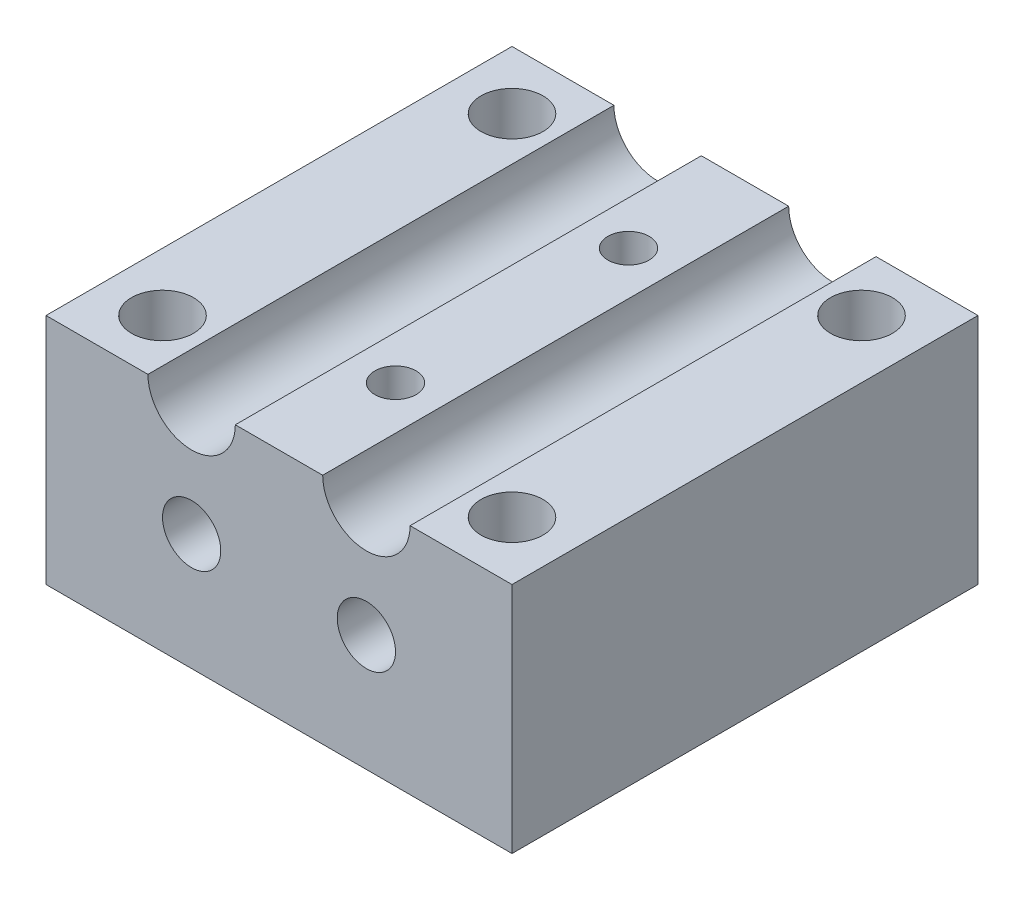
ISO-10303-21;
HEADER;
FILE_DESCRIPTION(('STEP AP214'),'2;1');
FILE_NAME('part.step','',(''),(''),'','','');
FILE_SCHEMA(('AUTOMOTIVE_DESIGN { 1 0 10303 214 1 1 1 1 }'));
ENDSEC;
DATA;
#1=APPLICATION_CONTEXT('core data for automotive mechanical design processes');
#2=APPLICATION_PROTOCOL_DEFINITION('international standard','automotive_design',2000,#1);
#3=PRODUCT_CONTEXT('',#1,'mechanical');
#4=PRODUCT('Part','Part','',(#3));
#5=PRODUCT_RELATED_PRODUCT_CATEGORY('part','',(#4));
#6=PRODUCT_DEFINITION_FORMATION('','',#4);
#7=PRODUCT_DEFINITION_CONTEXT('part definition',#1,'design');
#8=PRODUCT_DEFINITION('design','',#6,#7);
#9=PRODUCT_DEFINITION_SHAPE('','',#8);
#10=(LENGTH_UNIT() NAMED_UNIT(*) SI_UNIT(.MILLI.,.METRE.));
#11=(NAMED_UNIT(*) PLANE_ANGLE_UNIT() SI_UNIT($,.RADIAN.));
#12=(NAMED_UNIT(*) SI_UNIT($,.STERADIAN.) SOLID_ANGLE_UNIT());
#13=UNCERTAINTY_MEASURE_WITH_UNIT(LENGTH_MEASURE(1.E-05),#10,'distance_accuracy_value','');
#14=(GEOMETRIC_REPRESENTATION_CONTEXT(3) GLOBAL_UNCERTAINTY_ASSIGNED_CONTEXT((#13)) GLOBAL_UNIT_ASSIGNED_CONTEXT((#10,
#11,#12)) REPRESENTATION_CONTEXT('',''));
#15=CARTESIAN_POINT('',(0.,0.,0.));
#16=DIRECTION('',(0.,0.,1.));
#17=DIRECTION('',(1.,0.,0.));
#18=AXIS2_PLACEMENT_3D('',#15,#16,#17);
#19=CARTESIAN_POINT('',(0.,25.4,0.));
#20=DIRECTION('',(0.,-1.,0.));
#21=DIRECTION('',(0.,0.,-1.));
#22=AXIS2_PLACEMENT_3D('',#19,#20,#21);
#23=PLANE('',#22);
#24=CARTESIAN_POINT('',(19.05,25.4,19.05));
#25=DIRECTION('',(0.,1.,0.));
#26=DIRECTION('',(0.,0.,1.));
#27=AXIS2_PLACEMENT_3D('',#24,#25,#26);
#28=CIRCLE('',#27,3.3782);
#29=CARTESIAN_POINT('',(19.05,25.4,22.4282));
#30=VERTEX_POINT('',#29);
#31=EDGE_CURVE('E169',#30,#30,#28,.T.);
#32=ORIENTED_EDGE('',*,*,#31,.F.);
#33=EDGE_LOOP('',(#32));
#34=FACE_BOUND('',#33,.T.);
#35=CARTESIAN_POINT('',(19.05,25.4,-19.05));
#36=DIRECTION('',(0.,1.,0.));
#37=DIRECTION('',(0.,0.,1.));
#38=AXIS2_PLACEMENT_3D('',#35,#36,#37);
#39=CIRCLE('',#38,3.3782);
#40=CARTESIAN_POINT('',(19.05,25.4,-15.6718));
#41=VERTEX_POINT('',#40);
#42=EDGE_CURVE('E163',#41,#41,#39,.T.);
#43=ORIENTED_EDGE('',*,*,#42,.F.);
#44=EDGE_LOOP('',(#43));
#45=FACE_BOUND('',#44,.T.);
#46=DIRECTION('',(-1.,0.,0.));
#47=VECTOR('',#46,1.);
#48=CARTESIAN_POINT('',(25.4,25.4,-25.4));
#49=LINE('',#48,#47);
#50=CARTESIAN_POINT('',(25.4,25.4,-25.4));
#51=VERTEX_POINT('',#50);
#52=CARTESIAN_POINT('',(14.2875,25.4,-25.4));
#53=VERTEX_POINT('',#52);
#54=EDGE_CURVE('E115',#51,#53,#49,.T.);
#55=ORIENTED_EDGE('',*,*,#54,.T.);
#56=DIRECTION('',(0.,0.,1.));
#57=VECTOR('',#56,1.);
#58=CARTESIAN_POINT('',(14.2875,25.4,-25.4));
#59=LINE('',#58,#57);
#60=CARTESIAN_POINT('',(14.2875,25.4,25.4));
#61=VERTEX_POINT('',#60);
#62=EDGE_CURVE('E49',#53,#61,#59,.T.);
#63=ORIENTED_EDGE('',*,*,#62,.T.);
#64=DIRECTION('',(1.,0.,0.));
#65=VECTOR('',#64,1.);
#66=CARTESIAN_POINT('',(25.4,25.4,25.4));
#67=LINE('',#66,#65);
#68=CARTESIAN_POINT('',(25.4,25.4,25.4));
#69=VERTEX_POINT('',#68);
#70=EDGE_CURVE('E152',#61,#69,#67,.T.);
#71=ORIENTED_EDGE('',*,*,#70,.T.);
#72=DIRECTION('',(0.,0.,-1.));
#73=VECTOR('',#72,1.);
#74=CARTESIAN_POINT('',(25.4,25.4,-25.4));
#75=LINE('',#74,#73);
#76=EDGE_CURVE('E119',#69,#51,#75,.T.);
#77=ORIENTED_EDGE('',*,*,#76,.T.);
#78=EDGE_LOOP('',(#55,#63,#71,#77));
#79=FACE_BOUND('',#78,.T.);
#80=ADVANCED_FACE('F34',(#34,#45,#79),#23,.F.);
#81=CARTESIAN_POINT('',(0.,25.4,-12.7));
#82=DIRECTION('',(0.,1.,0.));
#83=DIRECTION('',(0.,0.,1.));
#84=AXIS2_PLACEMENT_3D('',#81,#82,#83);
#85=CIRCLE('',#84,2.24789999999999);
#86=CARTESIAN_POINT('',(0.,25.4,-10.4521));
#87=VERTEX_POINT('',#86);
#88=EDGE_CURVE('E205',#87,#87,#85,.T.);
#89=ORIENTED_EDGE('',*,*,#88,.F.);
#90=EDGE_LOOP('',(#89));
#91=FACE_BOUND('',#90,.T.);
#92=CARTESIAN_POINT('',(0.,25.4,12.7));
#93=DIRECTION('',(0.,1.,0.));
#94=DIRECTION('',(0.,0.,1.));
#95=AXIS2_PLACEMENT_3D('',#92,#93,#94);
#96=CIRCLE('',#95,2.24789999999999);
#97=CARTESIAN_POINT('',(0.,25.4,14.9479));
#98=VERTEX_POINT('',#97);
#99=EDGE_CURVE('E199',#98,#98,#96,.T.);
#100=ORIENTED_EDGE('',*,*,#99,.F.);
#101=EDGE_LOOP('',(#100));
#102=FACE_BOUND('',#101,.T.);
#103=CARTESIAN_POINT('',(-4.7625,25.4,25.4));
#104=VERTEX_POINT('',#103);
#105=CARTESIAN_POINT('',(4.76250000000001,25.4,25.4));
#106=VERTEX_POINT('',#105);
#107=EDGE_CURVE('E110',#104,#106,#67,.T.);
#108=ORIENTED_EDGE('',*,*,#107,.T.);
#109=DIRECTION('',(0.,0.,1.));
#110=VECTOR('',#109,1.);
#111=CARTESIAN_POINT('',(4.76250000000001,25.4,-25.4));
#112=LINE('',#111,#110);
#113=CARTESIAN_POINT('',(4.76250000000001,25.4,-25.4));
#114=VERTEX_POINT('',#113);
#115=EDGE_CURVE('E98',#106,#114,#112,.F.);
#116=ORIENTED_EDGE('',*,*,#115,.T.);
#117=CARTESIAN_POINT('',(-4.7625,25.4,-25.4));
#118=VERTEX_POINT('',#117);
#119=EDGE_CURVE('E108',#114,#118,#49,.T.);
#120=ORIENTED_EDGE('',*,*,#119,.T.);
#121=DIRECTION('',(0.,0.,1.));
#122=VECTOR('',#121,1.);
#123=CARTESIAN_POINT('',(-4.7625,25.4,-25.4));
#124=LINE('',#123,#122);
#125=EDGE_CURVE('E42',#118,#104,#124,.T.);
#126=ORIENTED_EDGE('',*,*,#125,.T.);
#127=EDGE_LOOP('',(#108,#116,#120,#126));
#128=FACE_BOUND('',#127,.T.);
#129=ADVANCED_FACE('F106',(#91,#102,#128),#23,.F.);
#130=CARTESIAN_POINT('',(-25.4,25.4,-25.4));
#131=DIRECTION('',(1.,0.,0.));
#132=DIRECTION('',(0.,0.,-1.));
#133=AXIS2_PLACEMENT_3D('',#130,#131,#132);
#134=PLANE('',#133);
#135=DIRECTION('',(0.,0.,1.));
#136=VECTOR('',#135,1.);
#137=CARTESIAN_POINT('',(-25.4,0.,-25.4));
#138=LINE('',#137,#136);
#139=CARTESIAN_POINT('',(-25.4,0.,-25.4));
#140=VERTEX_POINT('',#139);
#141=CARTESIAN_POINT('',(-25.4,0.,25.4));
#142=VERTEX_POINT('',#141);
#143=EDGE_CURVE('E123',#140,#142,#138,.T.);
#144=ORIENTED_EDGE('',*,*,#143,.T.);
#145=DIRECTION('',(0.,-1.,0.));
#146=VECTOR('',#145,1.);
#147=CARTESIAN_POINT('',(-25.4,25.4,25.4));
#148=LINE('',#147,#146);
#149=CARTESIAN_POINT('',(-25.4,25.4,25.4));
#150=VERTEX_POINT('',#149);
#151=EDGE_CURVE('E141',#150,#142,#148,.T.);
#152=ORIENTED_EDGE('',*,*,#151,.F.);
#153=DIRECTION('',(0.,0.,1.));
#154=VECTOR('',#153,1.);
#155=CARTESIAN_POINT('',(-25.4,25.4,-25.4));
#156=LINE('',#155,#154);
#157=CARTESIAN_POINT('',(-25.4,25.4,-25.4));
#158=VERTEX_POINT('',#157);
#159=EDGE_CURVE('E132',#158,#150,#156,.T.);
#160=ORIENTED_EDGE('',*,*,#159,.F.);
#161=DIRECTION('',(0.,-1.,0.));
#162=VECTOR('',#161,1.);
#163=CARTESIAN_POINT('',(-25.4,25.4,-25.4));
#164=LINE('',#163,#162);
#165=EDGE_CURVE('E118',#158,#140,#164,.T.);
#166=ORIENTED_EDGE('',*,*,#165,.T.);
#167=EDGE_LOOP('',(#144,#152,#160,#166));
#168=FACE_BOUND('',#167,.T.);
#169=ADVANCED_FACE('F36',(#168),#134,.F.);
#170=CARTESIAN_POINT('',(25.4,25.4,25.4));
#171=DIRECTION('',(0.,0.,-1.));
#172=DIRECTION('',(-1.,0.,0.));
#173=AXIS2_PLACEMENT_3D('',#170,#171,#172);
#174=PLANE('',#173);
#175=CARTESIAN_POINT('',(9.525,12.7,25.4));
#176=DIRECTION('',(0.,0.,1.));
#177=DIRECTION('',(1.,0.,0.));
#178=AXIS2_PLACEMENT_3D('',#175,#176,#177);
#179=CIRCLE('',#178,3.175);
#180=CARTESIAN_POINT('',(12.7,12.7,25.4));
#181=VERTEX_POINT('',#180);
#182=EDGE_CURVE('E191',#181,#181,#179,.T.);
#183=ORIENTED_EDGE('',*,*,#182,.F.);
#184=EDGE_LOOP('',(#183));
#185=FACE_BOUND('',#184,.T.);
#186=CARTESIAN_POINT('',(-9.525,12.7,25.4));
#187=DIRECTION('',(0.,0.,1.));
#188=DIRECTION('',(1.,0.,0.));
#189=AXIS2_PLACEMENT_3D('',#186,#187,#188);
#190=CIRCLE('',#189,3.175);
#191=CARTESIAN_POINT('',(-6.35,12.7,25.4));
#192=VERTEX_POINT('',#191);
#193=EDGE_CURVE('E185',#192,#192,#190,.T.);
#194=ORIENTED_EDGE('',*,*,#193,.F.);
#195=EDGE_LOOP('',(#194));
#196=FACE_BOUND('',#195,.T.);
#197=ORIENTED_EDGE('',*,*,#70,.F.);
#198=CARTESIAN_POINT('',(9.525,25.4,25.4));
#199=DIRECTION('',(0.,0.,1.));
#200=DIRECTION('',(1.,0.,0.));
#201=AXIS2_PLACEMENT_3D('',#198,#199,#200);
#202=CIRCLE('',#201,4.7625);
#203=EDGE_CURVE('E111',#106,#61,#202,.T.);
#204=ORIENTED_EDGE('',*,*,#203,.F.);
#205=ORIENTED_EDGE('',*,*,#107,.F.);
#206=CARTESIAN_POINT('',(-9.525,25.4,25.4));
#207=DIRECTION('',(0.,0.,1.));
#208=DIRECTION('',(1.,0.,0.));
#209=AXIS2_PLACEMENT_3D('',#206,#207,#208);
#210=CIRCLE('',#209,4.7625);
#211=CARTESIAN_POINT('',(-14.2875,25.4,25.4));
#212=VERTEX_POINT('',#211);
#213=EDGE_CURVE('E149',#212,#104,#210,.T.);
#214=ORIENTED_EDGE('',*,*,#213,.F.);
#215=EDGE_CURVE('E151',#150,#212,#67,.T.);
#216=ORIENTED_EDGE('',*,*,#215,.F.);
#217=ORIENTED_EDGE('',*,*,#151,.T.);
#218=DIRECTION('',(1.,0.,0.));
#219=VECTOR('',#218,1.);
#220=CARTESIAN_POINT('',(25.4,0.,25.4));
#221=LINE('',#220,#219);
#222=CARTESIAN_POINT('',(25.4,0.,25.4));
#223=VERTEX_POINT('',#222);
#224=EDGE_CURVE('E126',#142,#223,#221,.T.);
#225=ORIENTED_EDGE('',*,*,#224,.T.);
#226=DIRECTION('',(0.,-1.,0.));
#227=VECTOR('',#226,1.);
#228=CARTESIAN_POINT('',(25.4,25.4,25.4));
#229=LINE('',#228,#227);
#230=EDGE_CURVE('E138',#69,#223,#229,.T.);
#231=ORIENTED_EDGE('',*,*,#230,.F.);
#232=EDGE_LOOP('',(#197,#204,#205,#214,#216,#217,#225,#231));
#233=FACE_BOUND('',#232,.T.);
#234=ADVANCED_FACE('F148',(#185,#196,#233),#174,.F.);
#235=CARTESIAN_POINT('',(25.4,25.4,-25.4));
#236=DIRECTION('',(-1.,0.,0.));
#237=DIRECTION('',(0.,0.,1.));
#238=AXIS2_PLACEMENT_3D('',#235,#236,#237);
#239=PLANE('',#238);
#240=DIRECTION('',(0.,0.,-1.));
#241=VECTOR('',#240,1.);
#242=CARTESIAN_POINT('',(25.4,0.,-25.4));
#243=LINE('',#242,#241);
#244=CARTESIAN_POINT('',(25.4,0.,-25.4));
#245=VERTEX_POINT('',#244);
#246=EDGE_CURVE('E128',#223,#245,#243,.T.);
#247=ORIENTED_EDGE('',*,*,#246,.T.);
#248=DIRECTION('',(0.,-1.,0.));
#249=VECTOR('',#248,1.);
#250=CARTESIAN_POINT('',(25.4,25.4,-25.4));
#251=LINE('',#250,#249);
#252=EDGE_CURVE('E135',#51,#245,#251,.T.);
#253=ORIENTED_EDGE('',*,*,#252,.F.);
#254=ORIENTED_EDGE('',*,*,#76,.F.);
#255=ORIENTED_EDGE('',*,*,#230,.T.);
#256=EDGE_LOOP('',(#247,#253,#254,#255));
#257=FACE_BOUND('',#256,.T.);
#258=ADVANCED_FACE('F249',(#257),#239,.F.);
#259=CARTESIAN_POINT('',(25.4,25.4,-25.4));
#260=DIRECTION('',(0.,0.,1.));
#261=DIRECTION('',(1.,0.,0.));
#262=AXIS2_PLACEMENT_3D('',#259,#260,#261);
#263=PLANE('',#262);
#264=CARTESIAN_POINT('',(9.525,12.7,-25.4));
#265=DIRECTION('',(0.,0.,1.));
#266=DIRECTION('',(1.,0.,0.));
#267=AXIS2_PLACEMENT_3D('',#264,#265,#266);
#268=CIRCLE('',#267,3.175);
#269=CARTESIAN_POINT('',(12.7,12.7,-25.4));
#270=VERTEX_POINT('',#269);
#271=EDGE_CURVE('E188',#270,#270,#268,.T.);
#272=ORIENTED_EDGE('',*,*,#271,.T.);
#273=EDGE_LOOP('',(#272));
#274=FACE_BOUND('',#273,.T.);
#275=CARTESIAN_POINT('',(-9.525,12.7,-25.4));
#276=DIRECTION('',(0.,0.,1.));
#277=DIRECTION('',(1.,0.,0.));
#278=AXIS2_PLACEMENT_3D('',#275,#276,#277);
#279=CIRCLE('',#278,3.175);
#280=CARTESIAN_POINT('',(-6.35,12.7,-25.4));
#281=VERTEX_POINT('',#280);
#282=EDGE_CURVE('E184',#281,#281,#279,.T.);
#283=ORIENTED_EDGE('',*,*,#282,.T.);
#284=EDGE_LOOP('',(#283));
#285=FACE_BOUND('',#284,.T.);
#286=ORIENTED_EDGE('',*,*,#119,.F.);
#287=CARTESIAN_POINT('',(9.525,25.4,-25.4));
#288=DIRECTION('',(0.,0.,1.));
#289=DIRECTION('',(1.,0.,0.));
#290=AXIS2_PLACEMENT_3D('',#287,#288,#289);
#291=CIRCLE('',#290,4.7625);
#292=EDGE_CURVE('E11',#114,#53,#291,.T.);
#293=ORIENTED_EDGE('',*,*,#292,.T.);
#294=ORIENTED_EDGE('',*,*,#54,.F.);
#295=ORIENTED_EDGE('',*,*,#252,.T.);
#296=DIRECTION('',(-1.,0.,0.));
#297=VECTOR('',#296,1.);
#298=CARTESIAN_POINT('',(25.4,0.,-25.4));
#299=LINE('',#298,#297);
#300=EDGE_CURVE('E130',#245,#140,#299,.T.);
#301=ORIENTED_EDGE('',*,*,#300,.T.);
#302=ORIENTED_EDGE('',*,*,#165,.F.);
#303=CARTESIAN_POINT('',(-14.2875,25.4,-25.4));
#304=VERTEX_POINT('',#303);
#305=EDGE_CURVE('E116',#304,#158,#49,.T.);
#306=ORIENTED_EDGE('',*,*,#305,.F.);
#307=CARTESIAN_POINT('',(-9.525,25.4,-25.4));
#308=DIRECTION('',(0.,0.,1.));
#309=DIRECTION('',(1.,0.,0.));
#310=AXIS2_PLACEMENT_3D('',#307,#308,#309);
#311=CIRCLE('',#310,4.7625);
#312=EDGE_CURVE('E56',#304,#118,#311,.T.);
#313=ORIENTED_EDGE('',*,*,#312,.T.);
#314=EDGE_LOOP('',(#286,#293,#294,#295,#301,#302,#306,#313));
#315=FACE_BOUND('',#314,.T.);
#316=ADVANCED_FACE('F113',(#274,#285,#315),#263,.F.);
#317=CARTESIAN_POINT('',(-19.05,25.4,-19.05));
#318=DIRECTION('',(0.,1.,0.));
#319=DIRECTION('',(0.,0.,1.));
#320=AXIS2_PLACEMENT_3D('',#317,#318,#319);
#321=CIRCLE('',#320,3.3782);
#322=CARTESIAN_POINT('',(-19.05,25.4,-15.6718));
#323=VERTEX_POINT('',#322);
#324=EDGE_CURVE('E181',#323,#323,#321,.T.);
#325=ORIENTED_EDGE('',*,*,#324,.F.);
#326=EDGE_LOOP('',(#325));
#327=FACE_BOUND('',#326,.T.);
#328=CARTESIAN_POINT('',(-19.05,25.4,19.05));
#329=DIRECTION('',(0.,1.,0.));
#330=DIRECTION('',(0.,0.,1.));
#331=AXIS2_PLACEMENT_3D('',#328,#329,#330);
#332=CIRCLE('',#331,3.3782);
#333=CARTESIAN_POINT('',(-19.05,25.4,22.4282));
#334=VERTEX_POINT('',#333);
#335=EDGE_CURVE('E175',#334,#334,#332,.T.);
#336=ORIENTED_EDGE('',*,*,#335,.F.);
#337=EDGE_LOOP('',(#336));
#338=FACE_BOUND('',#337,.T.);
#339=ORIENTED_EDGE('',*,*,#215,.T.);
#340=DIRECTION('',(0.,0.,1.));
#341=VECTOR('',#340,1.);
#342=CARTESIAN_POINT('',(-14.2875,25.4,-25.4));
#343=LINE('',#342,#341);
#344=EDGE_CURVE('E144',#212,#304,#343,.F.);
#345=ORIENTED_EDGE('',*,*,#344,.T.);
#346=ORIENTED_EDGE('',*,*,#305,.T.);
#347=ORIENTED_EDGE('',*,*,#159,.T.);
#348=EDGE_LOOP('',(#339,#345,#346,#347));
#349=FACE_BOUND('',#348,.T.);
#350=ADVANCED_FACE('F214',(#327,#338,#349),#23,.F.);
#351=CARTESIAN_POINT('',(0.,0.,0.));
#352=DIRECTION('',(0.,-1.,0.));
#353=DIRECTION('',(0.,0.,-1.));
#354=AXIS2_PLACEMENT_3D('',#351,#352,#353);
#355=PLANE('',#354);
#356=CARTESIAN_POINT('',(0.,0.,-12.7));
#357=DIRECTION('',(0.,1.,0.));
#358=DIRECTION('',(0.,0.,1.));
#359=AXIS2_PLACEMENT_3D('',#356,#357,#358);
#360=CIRCLE('',#359,2.24789999999999);
#361=CARTESIAN_POINT('',(0.,0.,-10.4521));
#362=VERTEX_POINT('',#361);
#363=EDGE_CURVE('E202',#362,#362,#360,.T.);
#364=ORIENTED_EDGE('',*,*,#363,.T.);
#365=EDGE_LOOP('',(#364));
#366=FACE_BOUND('',#365,.T.);
#367=CARTESIAN_POINT('',(0.,0.,12.7));
#368=DIRECTION('',(0.,1.,0.));
#369=DIRECTION('',(0.,0.,1.));
#370=AXIS2_PLACEMENT_3D('',#367,#368,#369);
#371=CIRCLE('',#370,2.24789999999999);
#372=CARTESIAN_POINT('',(0.,0.,14.9479));
#373=VERTEX_POINT('',#372);
#374=EDGE_CURVE('E194',#373,#373,#371,.T.);
#375=ORIENTED_EDGE('',*,*,#374,.T.);
#376=EDGE_LOOP('',(#375));
#377=FACE_BOUND('',#376,.T.);
#378=CARTESIAN_POINT('',(-19.05,0.,-19.05));
#379=DIRECTION('',(0.,1.,0.));
#380=DIRECTION('',(0.,0.,1.));
#381=AXIS2_PLACEMENT_3D('',#378,#379,#380);
#382=CIRCLE('',#381,3.37819999999999);
#383=CARTESIAN_POINT('',(-19.05,0.,-15.6718));
#384=VERTEX_POINT('',#383);
#385=EDGE_CURVE('E178',#384,#384,#382,.T.);
#386=ORIENTED_EDGE('',*,*,#385,.T.);
#387=EDGE_LOOP('',(#386));
#388=FACE_BOUND('',#387,.T.);
#389=CARTESIAN_POINT('',(-19.05,0.,19.05));
#390=DIRECTION('',(0.,1.,0.));
#391=DIRECTION('',(0.,0.,1.));
#392=AXIS2_PLACEMENT_3D('',#389,#390,#391);
#393=CIRCLE('',#392,3.37819999999999);
#394=CARTESIAN_POINT('',(-19.05,0.,22.4282));
#395=VERTEX_POINT('',#394);
#396=EDGE_CURVE('E172',#395,#395,#393,.T.);
#397=ORIENTED_EDGE('',*,*,#396,.T.);
#398=EDGE_LOOP('',(#397));
#399=FACE_BOUND('',#398,.T.);
#400=CARTESIAN_POINT('',(19.05,0.,19.05));
#401=DIRECTION('',(0.,1.,0.));
#402=DIRECTION('',(0.,0.,1.));
#403=AXIS2_PLACEMENT_3D('',#400,#401,#402);
#404=CIRCLE('',#403,3.37819999999999);
#405=CARTESIAN_POINT('',(19.05,0.,22.4282));
#406=VERTEX_POINT('',#405);
#407=EDGE_CURVE('E166',#406,#406,#404,.T.);
#408=ORIENTED_EDGE('',*,*,#407,.T.);
#409=EDGE_LOOP('',(#408));
#410=FACE_BOUND('',#409,.T.);
#411=CARTESIAN_POINT('',(19.05,0.,-19.05));
#412=DIRECTION('',(0.,1.,0.));
#413=DIRECTION('',(0.,0.,1.));
#414=AXIS2_PLACEMENT_3D('',#411,#412,#413);
#415=CIRCLE('',#414,3.37819999999999);
#416=CARTESIAN_POINT('',(19.05,0.,-15.6718));
#417=VERTEX_POINT('',#416);
#418=EDGE_CURVE('E160',#417,#417,#415,.T.);
#419=ORIENTED_EDGE('',*,*,#418,.T.);
#420=EDGE_LOOP('',(#419));
#421=FACE_BOUND('',#420,.T.);
#422=ORIENTED_EDGE('',*,*,#143,.F.);
#423=ORIENTED_EDGE('',*,*,#300,.F.);
#424=ORIENTED_EDGE('',*,*,#246,.F.);
#425=ORIENTED_EDGE('',*,*,#224,.F.);
#426=EDGE_LOOP('',(#422,#423,#424,#425));
#427=FACE_BOUND('',#426,.T.);
#428=ADVANCED_FACE('F241',(#366,#377,#388,#399,#410,#421,#427),#355,.T.);
#429=CARTESIAN_POINT('',(-9.525,25.4,-25.4));
#430=DIRECTION('',(0.,0.,1.));
#431=DIRECTION('',(1.,0.,0.));
#432=AXIS2_PLACEMENT_3D('',#429,#430,#431);
#433=CYLINDRICAL_SURFACE('',#432,4.7625);
#434=ORIENTED_EDGE('',*,*,#312,.F.);
#435=ORIENTED_EDGE('',*,*,#344,.F.);
#436=ORIENTED_EDGE('',*,*,#213,.T.);
#437=ORIENTED_EDGE('',*,*,#125,.F.);
#438=EDGE_LOOP('',(#434,#435,#436,#437));
#439=FACE_BOUND('',#438,.T.);
#440=ADVANCED_FACE('F247',(#439),#433,.F.);
#441=CARTESIAN_POINT('',(9.525,25.4,-25.4));
#442=DIRECTION('',(0.,0.,1.));
#443=DIRECTION('',(1.,0.,0.));
#444=AXIS2_PLACEMENT_3D('',#441,#442,#443);
#445=CYLINDRICAL_SURFACE('',#444,4.7625);
#446=ORIENTED_EDGE('',*,*,#292,.F.);
#447=ORIENTED_EDGE('',*,*,#115,.F.);
#448=ORIENTED_EDGE('',*,*,#203,.T.);
#449=ORIENTED_EDGE('',*,*,#62,.F.);
#450=EDGE_LOOP('',(#446,#447,#448,#449));
#451=FACE_BOUND('',#450,.T.);
#452=ADVANCED_FACE('F97',(#451),#445,.F.);
#453=CARTESIAN_POINT('',(19.05,25.4,-19.05));
#454=DIRECTION('',(0.,1.,0.));
#455=DIRECTION('',(0.,0.,1.));
#456=AXIS2_PLACEMENT_3D('',#453,#454,#455);
#457=CYLINDRICAL_SURFACE('',#456,3.3782);
#458=ORIENTED_EDGE('',*,*,#418,.F.);
#459=EDGE_LOOP('',(#458));
#460=FACE_BOUND('',#459,.T.);
#461=ORIENTED_EDGE('',*,*,#42,.T.);
#462=EDGE_LOOP('',(#461));
#463=FACE_BOUND('',#462,.T.);
#464=ADVANCED_FACE('F300',(#460,#463),#457,.F.);
#465=CARTESIAN_POINT('',(19.05,25.4,19.05));
#466=DIRECTION('',(0.,1.,0.));
#467=DIRECTION('',(0.,0.,1.));
#468=AXIS2_PLACEMENT_3D('',#465,#466,#467);
#469=CYLINDRICAL_SURFACE('',#468,3.3782);
#470=ORIENTED_EDGE('',*,*,#407,.F.);
#471=EDGE_LOOP('',(#470));
#472=FACE_BOUND('',#471,.T.);
#473=ORIENTED_EDGE('',*,*,#31,.T.);
#474=EDGE_LOOP('',(#473));
#475=FACE_BOUND('',#474,.T.);
#476=ADVANCED_FACE('F296',(#472,#475),#469,.F.);
#477=CARTESIAN_POINT('',(-19.05,25.4,19.05));
#478=DIRECTION('',(0.,1.,0.));
#479=DIRECTION('',(0.,0.,1.));
#480=AXIS2_PLACEMENT_3D('',#477,#478,#479);
#481=CYLINDRICAL_SURFACE('',#480,3.3782);
#482=ORIENTED_EDGE('',*,*,#396,.F.);
#483=EDGE_LOOP('',(#482));
#484=FACE_BOUND('',#483,.T.);
#485=ORIENTED_EDGE('',*,*,#335,.T.);
#486=EDGE_LOOP('',(#485));
#487=FACE_BOUND('',#486,.T.);
#488=ADVANCED_FACE('F289',(#484,#487),#481,.F.);
#489=CARTESIAN_POINT('',(-19.05,25.4,-19.05));
#490=DIRECTION('',(0.,1.,0.));
#491=DIRECTION('',(0.,0.,1.));
#492=AXIS2_PLACEMENT_3D('',#489,#490,#491);
#493=CYLINDRICAL_SURFACE('',#492,3.3782);
#494=ORIENTED_EDGE('',*,*,#385,.F.);
#495=EDGE_LOOP('',(#494));
#496=FACE_BOUND('',#495,.T.);
#497=ORIENTED_EDGE('',*,*,#324,.T.);
#498=EDGE_LOOP('',(#497));
#499=FACE_BOUND('',#498,.T.);
#500=ADVANCED_FACE('F283',(#496,#499),#493,.F.);
#501=CARTESIAN_POINT('',(-9.525,12.7,-25.4));
#502=DIRECTION('',(0.,0.,1.));
#503=DIRECTION('',(1.,0.,0.));
#504=AXIS2_PLACEMENT_3D('',#501,#502,#503);
#505=CYLINDRICAL_SURFACE('',#504,3.175);
#506=ORIENTED_EDGE('',*,*,#282,.F.);
#507=EDGE_LOOP('',(#506));
#508=FACE_BOUND('',#507,.T.);
#509=ORIENTED_EDGE('',*,*,#193,.T.);
#510=EDGE_LOOP('',(#509));
#511=FACE_BOUND('',#510,.T.);
#512=ADVANCED_FACE('F228',(#508,#511),#505,.F.);
#513=CARTESIAN_POINT('',(9.525,12.7,-25.4));
#514=DIRECTION('',(0.,0.,1.));
#515=DIRECTION('',(1.,0.,0.));
#516=AXIS2_PLACEMENT_3D('',#513,#514,#515);
#517=CYLINDRICAL_SURFACE('',#516,3.175);
#518=ORIENTED_EDGE('',*,*,#271,.F.);
#519=EDGE_LOOP('',(#518));
#520=FACE_BOUND('',#519,.T.);
#521=ORIENTED_EDGE('',*,*,#182,.T.);
#522=EDGE_LOOP('',(#521));
#523=FACE_BOUND('',#522,.T.);
#524=ADVANCED_FACE('F219',(#520,#523),#517,.F.);
#525=CARTESIAN_POINT('',(0.,25.4,12.7));
#526=DIRECTION('',(0.,1.,0.));
#527=DIRECTION('',(0.,0.,1.));
#528=AXIS2_PLACEMENT_3D('',#525,#526,#527);
#529=CYLINDRICAL_SURFACE('',#528,2.24789999999999);
#530=ORIENTED_EDGE('',*,*,#374,.F.);
#531=EDGE_LOOP('',(#530));
#532=FACE_BOUND('',#531,.T.);
#533=ORIENTED_EDGE('',*,*,#99,.T.);
#534=EDGE_LOOP('',(#533));
#535=FACE_BOUND('',#534,.T.);
#536=ADVANCED_FACE('F217',(#532,#535),#529,.F.);
#537=CARTESIAN_POINT('',(0.,25.4,-12.7));
#538=DIRECTION('',(0.,1.,0.));
#539=DIRECTION('',(0.,0.,1.));
#540=AXIS2_PLACEMENT_3D('',#537,#538,#539);
#541=CYLINDRICAL_SURFACE('',#540,2.24789999999999);
#542=ORIENTED_EDGE('',*,*,#363,.F.);
#543=EDGE_LOOP('',(#542));
#544=FACE_BOUND('',#543,.T.);
#545=ORIENTED_EDGE('',*,*,#88,.T.);
#546=EDGE_LOOP('',(#545));
#547=FACE_BOUND('',#546,.T.);
#548=ADVANCED_FACE('F209',(#544,#547),#541,.F.);
#549=CLOSED_SHELL('',(#80,#129,#169,#234,#258,#316,#350,#428,#440,#452,#464,#476,#488,#500,#512,
#524,#536,#548));
#550=MANIFOLD_SOLID_BREP('B2',#549);
#551=ADVANCED_BREP_SHAPE_REPRESENTATION('',(#18,#550),#14);
#552=SHAPE_DEFINITION_REPRESENTATION(#9,#551);
ENDSEC;
END-ISO-10303-21;
